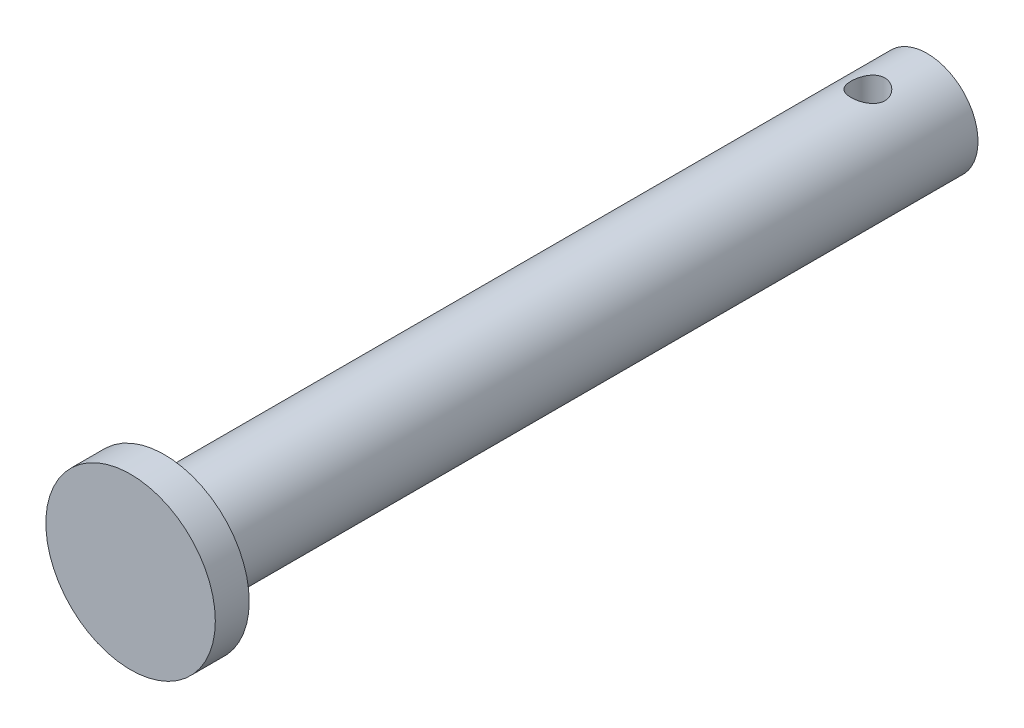
ISO-10303-21;
HEADER;
FILE_DESCRIPTION(('STEP AP214'),'2;1');
FILE_NAME('part.step','',(''),(''),'','','');
FILE_SCHEMA(('AUTOMOTIVE_DESIGN { 1 0 10303 214 1 1 1 1 }'));
ENDSEC;
DATA;
#1=APPLICATION_CONTEXT('core data for automotive mechanical design processes');
#2=APPLICATION_PROTOCOL_DEFINITION('international standard','automotive_design',2000,#1);
#3=PRODUCT_CONTEXT('',#1,'mechanical');
#4=PRODUCT('Part','Part','',(#3));
#5=PRODUCT_RELATED_PRODUCT_CATEGORY('part','',(#4));
#6=PRODUCT_DEFINITION_FORMATION('','',#4);
#7=PRODUCT_DEFINITION_CONTEXT('part definition',#1,'design');
#8=PRODUCT_DEFINITION('design','',#6,#7);
#9=PRODUCT_DEFINITION_SHAPE('','',#8);
#10=(LENGTH_UNIT() NAMED_UNIT(*) SI_UNIT(.MILLI.,.METRE.));
#11=(NAMED_UNIT(*) PLANE_ANGLE_UNIT() SI_UNIT($,.RADIAN.));
#12=(NAMED_UNIT(*) SI_UNIT($,.STERADIAN.) SOLID_ANGLE_UNIT());
#13=UNCERTAINTY_MEASURE_WITH_UNIT(LENGTH_MEASURE(1.E-05),#10,'distance_accuracy_value','');
#14=(GEOMETRIC_REPRESENTATION_CONTEXT(3) GLOBAL_UNCERTAINTY_ASSIGNED_CONTEXT((#13)) GLOBAL_UNIT_ASSIGNED_CONTEXT((#10,
#11,#12)) REPRESENTATION_CONTEXT('',''));
#15=CARTESIAN_POINT('',(0.,0.,0.));
#16=DIRECTION('',(0.,0.,1.));
#17=DIRECTION('',(1.,0.,0.));
#18=AXIS2_PLACEMENT_3D('',#15,#16,#17);
#19=CARTESIAN_POINT('',(0.,-5.,3.5));
#20=DIRECTION('',(0.,1.,0.));
#21=DIRECTION('',(0.,0.,1.));
#22=AXIS2_PLACEMENT_3D('',#19,#20,#21);
#23=CYLINDRICAL_SURFACE('',#22,1.);
#24=CARTESIAN_POINT('',(0.,-1.5,4.5));
#25=CARTESIAN_POINT('',(0.0502423583340643,-1.50000020822414,4.50000027481625));
#26=CARTESIAN_POINT('',(0.100484543566458,-1.49745401376693,4.49619301502226));
#27=CARTESIAN_POINT('',(0.199366529015833,-1.48752326211906,4.48120156794717));
#28=CARTESIAN_POINT('',(0.248005556977501,-1.48013640790618,4.47001387843836));
#29=CARTESIAN_POINT('',(0.342106153927126,-1.46125241202354,4.44094614133759));
#30=CARTESIAN_POINT('',(0.387581436328777,-1.44977452746657,4.42309742999603));
#31=CARTESIAN_POINT('',(0.474707645498629,-1.4236306893872,4.38146831836425));
#32=CARTESIAN_POINT('',(0.516358015804833,-1.40896427302755,4.35768705684972));
#33=CARTESIAN_POINT('',(0.598642350385054,-1.37613664684919,4.30267153131629));
#34=CARTESIAN_POINT('',(0.638890152730337,-1.3577844878966,4.27097606962856));
#35=CARTESIAN_POINT('',(0.713864022346369,-1.31991156541733,4.20213497567078));
#36=CARTESIAN_POINT('',(0.748582027719438,-1.30038915178416,4.16498153508114));
#37=CARTESIAN_POINT('',(0.81711148872748,-1.25864132339397,4.07947381619367));
#38=CARTESIAN_POINT('',(0.849915931813755,-1.23647533968899,4.03027717339828));
#39=CARTESIAN_POINT('',(0.906751785070868,-1.19542073676408,3.92581831117673));
#40=CARTESIAN_POINT('',(0.930798367132494,-1.17652647977327,3.87056679921861));
#41=CARTESIAN_POINT('',(0.963370175057203,-1.14988133320735,3.77164435328921));
#42=CARTESIAN_POINT('',(0.974372236180082,-1.14048813946218,3.72923577356309));
#43=CARTESIAN_POINT('',(0.9907530889261,-1.12628984829786,3.64262774762914));
#44=CARTESIAN_POINT('',(0.996141573259661,-1.12147684372013,3.59843152563681));
#45=CARTESIAN_POINT('',(1.00095682070629,-1.11718302804083,3.50926261057193));
#46=CARTESIAN_POINT('',(1.0003592145882,-1.11772401279478,3.46428748827441));
#47=CARTESIAN_POINT('',(0.993187906666196,-1.12409887741485,3.37518251324952));
#48=CARTESIAN_POINT('',(0.986609141899785,-1.12993724142592,3.33105340898369));
#49=CARTESIAN_POINT('',(0.968324971088713,-1.14563592995791,3.24676647438121));
#50=CARTESIAN_POINT('',(0.956858557405004,-1.15530744165153,3.20651933203848));
#51=CARTESIAN_POINT('',(0.929350592909502,-1.17754811463845,3.12848815450425));
#52=CARTESIAN_POINT('',(0.913307536614355,-1.19011822916388,3.09070493485137));
#53=CARTESIAN_POINT('',(0.87336909369832,-1.21982098202212,3.01048730235886));
#54=CARTESIAN_POINT('',(0.848540261643844,-1.23736158924507,2.96867004990595));
#55=CARTESIAN_POINT('',(0.793344802336531,-1.27345768922483,2.8893083025081));
#56=CARTESIAN_POINT('',(0.76297134504034,-1.29201441370946,2.85176917116288));
#57=CARTESIAN_POINT('',(0.689905826559714,-1.33271671862095,2.77372872714444));
#58=CARTESIAN_POINT('',(0.645969691404503,-1.35477372355024,2.7343329756443));
#59=CARTESIAN_POINT('',(0.551003999553815,-1.39609050337856,2.66340175274507));
#60=CARTESIAN_POINT('',(0.499981149675169,-1.41535288825285,2.63185892729896));
#61=CARTESIAN_POINT('',(0.402428913545607,-1.44572702044166,2.5832611406858));
#62=CARTESIAN_POINT('',(0.356978821685248,-1.45769630582498,2.56457831832979));
#63=CARTESIAN_POINT('',(0.263018021968461,-1.47753859515521,2.53394753718806));
#64=CARTESIAN_POINT('',(0.214509939501024,-1.48541506063844,2.52199388643409));
#65=CARTESIAN_POINT('',(0.115492726585953,-1.49637941078331,2.50541941738081));
#66=CARTESIAN_POINT('',(0.064975905967029,-1.49944661230576,2.50083026953082));
#67=CARTESIAN_POINT('',(-0.0362207596946121,-1.50041557482591,2.49937645571895));
#68=CARTESIAN_POINT('',(-0.0869005930932775,-1.49831769692815,2.50251124975561));
#69=CARTESIAN_POINT('',(-0.183227858602143,-1.48949794712138,2.51581202778098));
#70=CARTESIAN_POINT('',(-0.228978722339652,-1.48311123195135,2.52546864887766));
#71=CARTESIAN_POINT('',(-0.318058196213637,-1.46659224642397,2.55079784300638));
#72=CARTESIAN_POINT('',(-0.361386418785352,-1.45645937873408,2.5664713754639));
#73=CARTESIAN_POINT('',(-0.447332375233219,-1.4324817626467,2.60432614852268));
#74=CARTESIAN_POINT('',(-0.489748092316562,-1.41844935068245,2.62684407704176));
#75=CARTESIAN_POINT('',(-0.570341511977788,-1.38800927805403,2.67721664497231));
#76=CARTESIAN_POINT('',(-0.608516574097253,-1.37160015200652,2.70507458026297));
#77=CARTESIAN_POINT('',(-0.685927227415322,-1.33477273328243,2.77030393408237));
#78=CARTESIAN_POINT('',(-0.724375937862664,-1.31413078406203,2.80848313005202));
#79=CARTESIAN_POINT('',(-0.794669840332391,-1.27285586536855,2.89055571496407));
#80=CARTESIAN_POINT('',(-0.826510468230432,-1.25222291185946,2.9344530194994));
#81=CARTESIAN_POINT('',(-0.880623882794763,-1.21469839506517,3.0235712064292));
#82=CARTESIAN_POINT('',(-0.903478180804393,-1.19763798588662,3.06836601689986));
#83=CARTESIAN_POINT('',(-0.94248106887625,-1.16719487207113,3.16193632639057));
#84=CARTESIAN_POINT('',(-0.958641728453857,-1.1538055628277,3.2107044691977));
#85=CARTESIAN_POINT('',(-0.981179217293118,-1.13466604076532,3.30228224356704));
#86=CARTESIAN_POINT('',(-0.988792987823091,-1.12797499006895,3.34458590492947));
#87=CARTESIAN_POINT('',(-0.998496029624887,-1.11939733222928,3.43028664066772));
#88=CARTESIAN_POINT('',(-1.00059130142516,-1.11750550674066,3.47368247557323));
#89=CARTESIAN_POINT('',(-0.999119609907757,-1.11882100574833,3.56032152835836));
#90=CARTESIAN_POINT('',(-0.995549293852657,-1.12203134956834,3.60356464068146));
#91=CARTESIAN_POINT('',(-0.982984986109972,-1.1330522619864,3.68867176427148));
#92=CARTESIAN_POINT('',(-0.973983758587651,-1.14086896751217,3.73053385693038));
#93=CARTESIAN_POINT('',(-0.94796517835631,-1.1626342196827,3.82285559321431));
#94=CARTESIAN_POINT('',(-0.929450935941995,-1.17766166854602,3.87263385636953));
#95=CARTESIAN_POINT('',(-0.885422631474875,-1.21111080629161,3.96774341708941));
#96=CARTESIAN_POINT('',(-0.859898741785422,-1.22953724861882,4.01306834896843));
#97=CARTESIAN_POINT('',(-0.801991402694658,-1.26808593269725,4.09964094359684));
#98=CARTESIAN_POINT('',(-0.769491549448272,-1.2882329369107,4.14079937271926));
#99=CARTESIAN_POINT('',(-0.698358840177309,-1.32814150773993,4.21766123912123));
#100=CARTESIAN_POINT('',(-0.659724105134951,-1.3479029541764,4.25336299851241));
#101=CARTESIAN_POINT('',(-0.570728664877768,-1.38815775980392,4.32335605215706));
#102=CARTESIAN_POINT('',(-0.519480834775986,-1.40834902724558,4.35670932008983));
#103=CARTESIAN_POINT('',(-0.410434277887489,-1.44388832937518,4.41395663833199));
#104=CARTESIAN_POINT('',(-0.352646031225021,-1.45924396722731,4.43786555341182));
#105=CARTESIAN_POINT('',(-0.245717534917524,-1.48050822418367,4.47057728908202));
#106=CARTESIAN_POINT('',(-0.197506162628866,-1.48775740184446,4.48155551954935));
#107=CARTESIAN_POINT('',(-0.0995290060120642,-1.49750140070948,4.49626401626902));
#108=CARTESIAN_POINT('',(-0.0497644180940279,-1.49999979375663,4.499999727798));
#109=CARTESIAN_POINT('',(0.,-1.5,4.5));
#110=B_SPLINE_CURVE_WITH_KNOTS('',3,(#24,#25,#26,#27,#28,#29,#30,#31,#32,#33,#34,#35,#36,#37,
#38,#39,#40,#41,#42,#43,#44,#45,#46,#47,#48,#49,#50,#51,#52,#53,#54,#55,#56,#57,#58,#59,#60,#61,
#62,#63,#64,#65,#66,#67,#68,#69,#70,#71,#72,#73,#74,#75,#76,#77,#78,#79,#80,#81,#82,#83,#84,#85,
#86,#87,#88,#89,#90,#91,#92,#93,#94,#95,#96,#97,#98,#99,#100,#101,#102,#103,#104,#105,#106,#107,
#108,#109),.UNSPECIFIED.,.T.,.F.,(4,2,2,2,2,2,2,2,2,2,2,2,2,2,2,2,2,2,2,2,2,2,2,2,2,2,2,2,2,2,2,
2,2,2,2,2,2,2,2,2,2,2,4),(0.,0.150526613252699,0.301124707174343,0.451023076595115,
0.600943219336931,0.763585145002782,0.926462058021591,1.11503341647991,1.30327652722719,
1.43716846838014,1.57082883922904,1.70503355867689,1.83935198631676,1.96774431099011,
2.09617891902539,2.25073787329797,2.40548851889212,2.5935947724756,2.78152420149864,
2.93262043847562,3.0835886757059,3.23520441646309,3.38680955765891,3.5277654239542,
3.66874377568319,3.81826173413942,3.96787227471786,4.1411408806983,4.31452876587063,
4.473249676497,4.63168313315305,4.76162024003011,4.89141600161489,5.02128860137217,
5.15133461921144,5.31603304346011,5.48096356682587,5.64889622595852,5.81688041978686,
6.00897675773025,6.20076953274023,6.34997645676983,6.49907115623394),.UNSPECIFIED.);
#111=CARTESIAN_POINT('',(0.,-1.5,4.5));
#112=VERTEX_POINT('',#111);
#113=EDGE_CURVE('E42',#112,#112,#110,.T.);
#114=ORIENTED_EDGE('',*,*,#113,.T.);
#115=EDGE_LOOP('',(#114));
#116=FACE_BOUND('',#115,.T.);
#117=CARTESIAN_POINT('',(0.,-3.,4.5));
#118=CARTESIAN_POINT('',(0.0545633628867237,-3.00000015300943,4.50000025373164));
#119=CARTESIAN_POINT('',(0.10912519453855,-2.99849769507545,4.49551973387279));
#120=CARTESIAN_POINT('',(0.216641760872972,-2.99265210203281,4.47777089118278));
#121=CARTESIAN_POINT('',(0.269596328118818,-2.98830867202153,4.46450165605108));
#122=CARTESIAN_POINT('',(0.372332789501776,-2.97725307906443,4.42968075661596));
#123=CARTESIAN_POINT('',(0.422119825886034,-2.97054487730853,4.40814293754073));
#124=CARTESIAN_POINT('',(0.517374936805325,-2.95544445717342,4.35745882716166));
#125=CARTESIAN_POINT('',(0.562842156958706,-2.94705190667778,4.3283110349974));
#126=CARTESIAN_POINT('',(0.649741675022266,-2.92914094443005,4.26217419514125));
#127=CARTESIAN_POINT('',(0.691003700298309,-2.91959556463785,4.22496876573951));
#128=CARTESIAN_POINT('',(0.766832692702084,-2.90060314783122,4.14423284529344));
#129=CARTESIAN_POINT('',(0.801398185489462,-2.89115613290549,4.10070096507149));
#130=CARTESIAN_POINT('',(0.863824942227859,-2.87313332477274,4.00701488480354));
#131=CARTESIAN_POINT('',(0.891464858221032,-2.86459039275688,3.95670626026788));
#132=CARTESIAN_POINT('',(0.937818873877722,-2.84975305418601,3.85182390554146));
#133=CARTESIAN_POINT('',(0.956535697386765,-2.84345796160746,3.79725148283726));
#134=CARTESIAN_POINT('',(0.983873461509164,-2.83411303269377,3.68732677850329));
#135=CARTESIAN_POINT('',(0.99281344827177,-2.83096095769611,3.63206279151094));
#136=CARTESIAN_POINT('',(1.00134112333448,-2.82795656629508,3.52073624584412));
#137=CARTESIAN_POINT('',(1.00093170160472,-2.8281032302273,3.46467393929081));
#138=CARTESIAN_POINT('',(0.99101990370342,-2.8315901500818,3.35606336955598));
#139=CARTESIAN_POINT('',(0.981933913166995,-2.83478415867533,3.30347159708098));
#140=CARTESIAN_POINT('',(0.955606162849418,-2.84376657724551,3.20060658039317));
#141=CARTESIAN_POINT('',(0.938363426591871,-2.84955529784108,3.15033361456493));
#142=CARTESIAN_POINT('',(0.895939058060211,-2.86317911131249,3.05258725040852));
#143=CARTESIAN_POINT('',(0.870634048707263,-2.87104565793117,3.00517197453048));
#144=CARTESIAN_POINT('',(0.81288910630314,-2.88792558575726,2.91512909172028));
#145=CARTESIAN_POINT('',(0.780447112364006,-2.89693929790464,2.87250287306662));
#146=CARTESIAN_POINT('',(0.707349332682238,-2.91567329167741,2.79090840183923));
#147=CARTESIAN_POINT('',(0.666353150076312,-2.92540589354843,2.75224730549093));
#148=CARTESIAN_POINT('',(0.578339569970065,-2.94406938387037,2.68226873333661));
#149=CARTESIAN_POINT('',(0.531321595660815,-2.95300019538067,2.65095196183551));
#150=CARTESIAN_POINT('',(0.431947613046269,-2.96917107937794,2.59630369976493));
#151=CARTESIAN_POINT('',(0.379543276416337,-2.97639350008039,2.57305450865927));
#152=CARTESIAN_POINT('',(0.271269083364509,-2.98820567144435,2.53579682604429));
#153=CARTESIAN_POINT('',(0.215400438154955,-2.99279633654879,2.52178512457656));
#154=CARTESIAN_POINT('',(0.104383829529305,-2.99867627071441,2.50394433397764));
#155=CARTESIAN_POINT('',(0.0493095998648463,-3.00010001833731,2.49970019082725));
#156=CARTESIAN_POINT('',(-0.0607750699602355,-2.99988902694825,2.50033267359847));
#157=CARTESIAN_POINT('',(-0.115785519319646,-2.99825480419352,2.50520775997987));
#158=CARTESIAN_POINT('',(-0.222519866304258,-2.99220024717114,2.52361190773597));
#159=CARTESIAN_POINT('',(-0.274292806834856,-2.98786198711228,2.53688620604953));
#160=CARTESIAN_POINT('',(-0.37485595857956,-2.97691846830034,2.5713934444667));
#161=CARTESIAN_POINT('',(-0.423645788508559,-2.97031292046541,2.59262739946768));
#162=CARTESIAN_POINT('',(-0.518288296393321,-2.95528931287427,2.6430704318409));
#163=CARTESIAN_POINT('',(-0.564029959217329,-2.94682814756305,2.6724745932836));
#164=CARTESIAN_POINT('',(-0.650064830135404,-2.92905253915743,2.73819415001306));
#165=CARTESIAN_POINT('',(-0.690356367794894,-2.91973783591888,2.77451165603016));
#166=CARTESIAN_POINT('',(-0.766252507807013,-2.90076847982472,2.85497875100827));
#167=CARTESIAN_POINT('',(-0.801560969248491,-2.89111761095155,2.89940922693325));
#168=CARTESIAN_POINT('',(-0.864257522320853,-2.87299973286981,2.9937715678045));
#169=CARTESIAN_POINT('',(-0.891645547920843,-2.8645327335312,3.04370347861021));
#170=CARTESIAN_POINT('',(-0.93759693042336,-2.84982391820308,3.1476730153066));
#171=CARTESIAN_POINT('',(-0.956178132197766,-2.84357760900632,3.20170207924278));
#172=CARTESIAN_POINT('',(-0.983894666792162,-2.83410832399133,3.31237865012415));
#173=CARTESIAN_POINT('',(-0.993034254961243,-2.83088398622698,3.36902496543307));
#174=CARTESIAN_POINT('',(-1.00127628247038,-2.82797858875071,3.48019709601321));
#175=CARTESIAN_POINT('',(-1.00087025731093,-2.82812400344299,3.53468234025174));
#176=CARTESIAN_POINT('',(-0.991242293454878,-2.8315126992356,3.64276507489974));
#177=CARTESIAN_POINT('',(-0.982020879458887,-2.83475579595884,3.69636261795291));
#178=CARTESIAN_POINT('',(-0.95537181312698,-2.84384524278943,3.80013566301267));
#179=CARTESIAN_POINT('',(-0.93810334601488,-2.84964098015514,3.85035682500723));
#180=CARTESIAN_POINT('',(-0.895979365760382,-2.86316398825434,3.94722740693553));
#181=CARTESIAN_POINT('',(-0.871122168553979,-2.87089168765297,3.99387603118726));
#182=CARTESIAN_POINT('',(-0.813260692583249,-2.8878282922406,4.08448366992369));
#183=CARTESIAN_POINT('',(-0.779948242764532,-2.89708711641604,4.1282365018986));
#184=CARTESIAN_POINT('',(-0.706642883135697,-2.91583356283786,4.20968981338399));
#185=CARTESIAN_POINT('',(-0.666648084451495,-2.92532124912518,4.24738857568802));
#186=CARTESIAN_POINT('',(-0.579241556920674,-2.94390030525393,4.31714441228924));
#187=CARTESIAN_POINT('',(-0.531601513499725,-2.95296181801216,4.34892434775102));
#188=CARTESIAN_POINT('',(-0.431357357406628,-2.96925991172652,4.40399042885063));
#189=CARTESIAN_POINT('',(-0.378754518132349,-2.9764969590794,4.42727874592204));
#190=CARTESIAN_POINT('',(-0.272493647200975,-2.98805515068532,4.46372163248868));
#191=CARTESIAN_POINT('',(-0.218987757676408,-2.9924921242252,4.47728246626338));
#192=CARTESIAN_POINT('',(-0.110320416010247,-2.99846407064225,4.49542028067713));
#193=CARTESIAN_POINT('',(-0.0551594255687462,-2.99999984531906,4.49999974349654));
#194=CARTESIAN_POINT('',(0.,-3.,4.5));
#195=B_SPLINE_CURVE_WITH_KNOTS('',3,(#117,#118,#119,#120,#121,#122,#123,#124,#125,#126,#127,
#128,#129,#130,#131,#132,#133,#134,#135,#136,#137,#138,#139,#140,#141,#142,#143,#144,#145,#146,
#147,#148,#149,#150,#151,#152,#153,#154,#155,#156,#157,#158,#159,#160,#161,#162,#163,#164,#165,
#166,#167,#168,#169,#170,#171,#172,#173,#174,#175,#176,#177,#178,#179,#180,#181,#182,#183,#184,
#185,#186,#187,#188,#189,#190,#191,#192,#193,#194),.UNSPECIFIED.,.T.,.F.,(4,2,2,2,2,2,2,2,2,2,2,
2,2,2,2,2,2,2,2,2,2,2,2,2,2,2,2,2,2,2,2,2,2,2,2,2,2,2,4),(0.,0.163487106026011,0.32699118526752,
0.490222672870273,0.653486377799099,0.821846842827558,0.990244332875302,1.1634838482347,
1.33667044692833,1.5040192574184,1.67131633987486,1.8309682655128,1.99063930855482,
2.15288171155131,2.31517102558207,2.48593305811367,2.65671145966618,2.82918405650358,
3.00159668877208,3.1665358317517,3.33144713164177,3.49158157978214,3.65173645284104,
3.81610399843737,3.98052180821891,4.15241022880752,4.32430008234997,4.49584013824416,
4.66730284700846,4.82995666056619,4.99260079341185,5.15215587070228,5.31174638165788,
5.47830066681615,5.64490211113589,5.81799660824911,5.99104681142266,6.15636558363624,
6.3216386602795),.UNSPECIFIED.);
#196=CARTESIAN_POINT('',(0.,-3.,4.5));
#197=VERTEX_POINT('',#196);
#198=EDGE_CURVE('E68',#197,#197,#195,.T.);
#199=ORIENTED_EDGE('',*,*,#198,.F.);
#200=EDGE_LOOP('',(#199));
#201=FACE_BOUND('',#200,.T.);
#202=ADVANCED_FACE('F37',(#116,#201),#23,.F.);
#203=CARTESIAN_POINT('',(0.,0.,45.));
#204=DIRECTION('',(0.,0.,-1.));
#205=DIRECTION('',(-1.,0.,0.));
#206=AXIS2_PLACEMENT_3D('',#203,#204,#205);
#207=CYLINDRICAL_SURFACE('',#206,3.);
#208=ORIENTED_EDGE('',*,*,#198,.T.);
#209=EDGE_LOOP('',(#208));
#210=FACE_BOUND('',#209,.T.);
#211=CARTESIAN_POINT('',(0.,3.,4.5));
#212=CARTESIAN_POINT('',(-0.0545633628867228,3.00000015300944,4.50000025373164));
#213=CARTESIAN_POINT('',(-0.109125194538549,2.99849769507545,4.49551973387279));
#214=CARTESIAN_POINT('',(-0.216641760872972,2.99265210203281,4.47777089118278));
#215=CARTESIAN_POINT('',(-0.269596328118817,2.98830867202153,4.46450165605108));
#216=CARTESIAN_POINT('',(-0.372332789501775,2.97725307906443,4.42968075661596));
#217=CARTESIAN_POINT('',(-0.422119825886033,2.97054487730853,4.40814293754073));
#218=CARTESIAN_POINT('',(-0.517374936805324,2.95544445717342,4.35745882716166));
#219=CARTESIAN_POINT('',(-0.562842156958705,2.94705190667778,4.3283110349974));
#220=CARTESIAN_POINT('',(-0.649741675022265,2.92914094443005,4.26217419514125));
#221=CARTESIAN_POINT('',(-0.691003700298308,2.91959556463785,4.22496876573951));
#222=CARTESIAN_POINT('',(-0.766832692702083,2.90060314783122,4.14423284529344));
#223=CARTESIAN_POINT('',(-0.801398185489461,2.89115613290549,4.10070096507149));
#224=CARTESIAN_POINT('',(-0.863824942227858,2.87313332477274,4.00701488480354));
#225=CARTESIAN_POINT('',(-0.891464858221031,2.86459039275688,3.95670626026788));
#226=CARTESIAN_POINT('',(-0.937818873877721,2.84975305418601,3.85182390554146));
#227=CARTESIAN_POINT('',(-0.956535697386764,2.84345796160746,3.79725148283726));
#228=CARTESIAN_POINT('',(-0.983873461509163,2.83411303269377,3.68732677850329));
#229=CARTESIAN_POINT('',(-0.992813448271769,2.83096095769611,3.63206279151094));
#230=CARTESIAN_POINT('',(-1.00134112333448,2.82795656629508,3.52073624584412));
#231=CARTESIAN_POINT('',(-1.00093170160472,2.8281032302273,3.46467393929081));
#232=CARTESIAN_POINT('',(-0.991019903703419,2.8315901500818,3.35606336955598));
#233=CARTESIAN_POINT('',(-0.981933913166994,2.83478415867533,3.30347159708098));
#234=CARTESIAN_POINT('',(-0.955606162849417,2.84376657724551,3.20060658039317));
#235=CARTESIAN_POINT('',(-0.938363426591871,2.84955529784108,3.15033361456493));
#236=CARTESIAN_POINT('',(-0.895939058060211,2.86317911131249,3.05258725040852));
#237=CARTESIAN_POINT('',(-0.870634048707262,2.87104565793117,3.00517197453048));
#238=CARTESIAN_POINT('',(-0.812889106303139,2.88792558575726,2.91512909172028));
#239=CARTESIAN_POINT('',(-0.780447112364005,2.89693929790464,2.87250287306662));
#240=CARTESIAN_POINT('',(-0.707349332682237,2.91567329167741,2.79090840183923));
#241=CARTESIAN_POINT('',(-0.666353150076311,2.92540589354843,2.75224730549093));
#242=CARTESIAN_POINT('',(-0.578339569970064,2.94406938387037,2.68226873333661));
#243=CARTESIAN_POINT('',(-0.531321595660815,2.95300019538067,2.65095196183551));
#244=CARTESIAN_POINT('',(-0.431947613046268,2.96917107937794,2.59630369976493));
#245=CARTESIAN_POINT('',(-0.379543276416337,2.97639350008039,2.57305450865927));
#246=CARTESIAN_POINT('',(-0.271269083364508,2.98820567144435,2.53579682604429));
#247=CARTESIAN_POINT('',(-0.215400438154955,2.99279633654879,2.52178512457656));
#248=CARTESIAN_POINT('',(-0.104383829529304,2.99867627071441,2.50394433397764));
#249=CARTESIAN_POINT('',(-0.0493095998648456,3.00010001833731,2.49970019082725));
#250=CARTESIAN_POINT('',(0.0607750699602361,2.99988902694825,2.50033267359847));
#251=CARTESIAN_POINT('',(0.115785519319647,2.99825480419352,2.50520775997987));
#252=CARTESIAN_POINT('',(0.222519866304259,2.99220024717114,2.52361190773597));
#253=CARTESIAN_POINT('',(0.274292806834856,2.98786198711228,2.53688620604953));
#254=CARTESIAN_POINT('',(0.374855958579561,2.97691846830034,2.5713934444667));
#255=CARTESIAN_POINT('',(0.423645788508559,2.97031292046541,2.59262739946768));
#256=CARTESIAN_POINT('',(0.518288296393322,2.95528931287427,2.6430704318409));
#257=CARTESIAN_POINT('',(0.56402995921733,2.94682814756305,2.6724745932836));
#258=CARTESIAN_POINT('',(0.650064830135404,2.92905253915743,2.73819415001306));
#259=CARTESIAN_POINT('',(0.690356367794894,2.91973783591888,2.77451165603016));
#260=CARTESIAN_POINT('',(0.766252507807014,2.90076847982472,2.85497875100827));
#261=CARTESIAN_POINT('',(0.801560969248492,2.89111761095155,2.89940922693325));
#262=CARTESIAN_POINT('',(0.864257522320854,2.87299973286981,2.9937715678045));
#263=CARTESIAN_POINT('',(0.891645547920844,2.8645327335312,3.04370347861021));
#264=CARTESIAN_POINT('',(0.937596930423361,2.84982391820308,3.1476730153066));
#265=CARTESIAN_POINT('',(0.956178132197766,2.84357760900632,3.20170207924278));
#266=CARTESIAN_POINT('',(0.983894666792163,2.83410832399133,3.31237865012415));
#267=CARTESIAN_POINT('',(0.993034254961244,2.83088398622698,3.36902496543307));
#268=CARTESIAN_POINT('',(1.00127628247038,2.82797858875071,3.48019709601321));
#269=CARTESIAN_POINT('',(1.00087025731093,2.82812400344299,3.53468234025174));
#270=CARTESIAN_POINT('',(0.991242293454879,2.8315126992356,3.64276507489974));
#271=CARTESIAN_POINT('',(0.982020879458888,2.83475579595884,3.69636261795291));
#272=CARTESIAN_POINT('',(0.955371813126981,2.84384524278943,3.80013566301267));
#273=CARTESIAN_POINT('',(0.93810334601488,2.84964098015514,3.85035682500723));
#274=CARTESIAN_POINT('',(0.895979365760383,2.86316398825434,3.94722740693553));
#275=CARTESIAN_POINT('',(0.87112216855398,2.87089168765297,3.99387603118726));
#276=CARTESIAN_POINT('',(0.81326069258325,2.8878282922406,4.08448366992369));
#277=CARTESIAN_POINT('',(0.779948242764533,2.89708711641604,4.1282365018986));
#278=CARTESIAN_POINT('',(0.706642883135698,2.91583356283786,4.20968981338399));
#279=CARTESIAN_POINT('',(0.666648084451496,2.92532124912518,4.24738857568802));
#280=CARTESIAN_POINT('',(0.579241556920675,2.94390030525393,4.31714441228924));
#281=CARTESIAN_POINT('',(0.531601513499726,2.95296181801216,4.34892434775102));
#282=CARTESIAN_POINT('',(0.431357357406629,2.96925991172652,4.40399042885063));
#283=CARTESIAN_POINT('',(0.37875451813235,2.9764969590794,4.42727874592204));
#284=CARTESIAN_POINT('',(0.272493647200976,2.98805515068532,4.46372163248868));
#285=CARTESIAN_POINT('',(0.218987757676409,2.9924921242252,4.47728246626338));
#286=CARTESIAN_POINT('',(0.110320416010248,2.99846407064225,4.49542028067713));
#287=CARTESIAN_POINT('',(0.055159425568747,2.99999984531906,4.49999974349654));
#288=CARTESIAN_POINT('',(0.,3.,4.5));
#289=B_SPLINE_CURVE_WITH_KNOTS('',3,(#211,#212,#213,#214,#215,#216,#217,#218,#219,#220,#221,
#222,#223,#224,#225,#226,#227,#228,#229,#230,#231,#232,#233,#234,#235,#236,#237,#238,#239,#240,
#241,#242,#243,#244,#245,#246,#247,#248,#249,#250,#251,#252,#253,#254,#255,#256,#257,#258,#259,
#260,#261,#262,#263,#264,#265,#266,#267,#268,#269,#270,#271,#272,#273,#274,#275,#276,#277,#278,
#279,#280,#281,#282,#283,#284,#285,#286,#287,#288),.UNSPECIFIED.,.T.,.F.,(4,2,2,2,2,2,2,2,2,2,2,
2,2,2,2,2,2,2,2,2,2,2,2,2,2,2,2,2,2,2,2,2,2,2,2,2,2,2,4),(0.,0.163487106026011,0.32699118526752,
0.490222672870273,0.653486377799099,0.821846842827558,0.990244332875301,1.1634838482347,
1.33667044692833,1.5040192574184,1.67131633987485,1.8309682655128,1.99063930855482,
2.15288171155131,2.31517102558207,2.48593305811367,2.65671145966618,2.82918405650357,
3.00159668877208,3.1665358317517,3.33144713164177,3.49158157978213,3.65173645284104,
3.81610399843736,3.98052180821891,4.15241022880752,4.32430008234997,4.49584013824416,
4.66730284700846,4.82995666056619,4.99260079341185,5.15215587070227,5.31174638165787,
5.47830066681615,5.64490211113589,5.8179966082491,5.99104681142266,6.15636558363624,
6.3216386602795),.UNSPECIFIED.);
#290=CARTESIAN_POINT('',(0.,3.,4.5));
#291=VERTEX_POINT('',#290);
#292=EDGE_CURVE('E62',#291,#291,#289,.T.);
#293=ORIENTED_EDGE('',*,*,#292,.T.);
#294=EDGE_LOOP('',(#293));
#295=FACE_BOUND('',#294,.T.);
#296=CARTESIAN_POINT('',(0.,0.,45.));
#297=DIRECTION('',(0.,0.,1.));
#298=DIRECTION('',(1.,0.,0.));
#299=AXIS2_PLACEMENT_3D('',#296,#297,#298);
#300=CIRCLE('',#299,3.);
#301=CARTESIAN_POINT('',(3.,0.,45.));
#302=VERTEX_POINT('',#301);
#303=EDGE_CURVE('E10',#302,#302,#300,.T.);
#304=ORIENTED_EDGE('',*,*,#303,.F.);
#305=EDGE_LOOP('',(#304));
#306=FACE_BOUND('',#305,.T.);
#307=CARTESIAN_POINT('',(0.,0.,0.));
#308=DIRECTION('',(0.,0.,1.));
#309=DIRECTION('',(1.,0.,0.));
#310=AXIS2_PLACEMENT_3D('',#307,#308,#309);
#311=CIRCLE('',#310,3.);
#312=CARTESIAN_POINT('',(3.,0.,0.));
#313=VERTEX_POINT('',#312);
#314=EDGE_CURVE('E51',#313,#313,#311,.T.);
#315=ORIENTED_EDGE('',*,*,#314,.T.);
#316=EDGE_LOOP('',(#315));
#317=FACE_BOUND('',#316,.T.);
#318=ADVANCED_FACE('F39',(#210,#295,#306,#317),#207,.T.);
#319=CARTESIAN_POINT('',(0.,0.,0.));
#320=DIRECTION('',(0.,0.,1.));
#321=DIRECTION('',(1.,0.,0.));
#322=AXIS2_PLACEMENT_3D('',#319,#320,#321);
#323=PLANE('',#322);
#324=CARTESIAN_POINT('',(0.,0.,0.));
#325=DIRECTION('',(0.,0.,-1.));
#326=DIRECTION('',(-1.,0.,0.));
#327=AXIS2_PLACEMENT_3D('',#324,#325,#326);
#328=CIRCLE('',#327,1.5);
#329=CARTESIAN_POINT('',(-1.5,0.,0.));
#330=VERTEX_POINT('',#329);
#331=EDGE_CURVE('E123',#330,#330,#328,.T.);
#332=ORIENTED_EDGE('',*,*,#331,.F.);
#333=EDGE_LOOP('',(#332));
#334=FACE_BOUND('',#333,.T.);
#335=ORIENTED_EDGE('',*,*,#314,.F.);
#336=EDGE_LOOP('',(#335));
#337=FACE_BOUND('',#336,.T.);
#338=ADVANCED_FACE('F107',(#334,#337),#323,.F.);
#339=CARTESIAN_POINT('',(0.,0.,47.));
#340=DIRECTION('',(0.,0.,-1.));
#341=DIRECTION('',(-1.,0.,0.));
#342=AXIS2_PLACEMENT_3D('',#339,#340,#341);
#343=CYLINDRICAL_SURFACE('',#342,5.);
#344=CARTESIAN_POINT('',(0.,0.,47.));
#345=DIRECTION('',(0.,0.,1.));
#346=DIRECTION('',(1.,0.,0.));
#347=AXIS2_PLACEMENT_3D('',#344,#345,#346);
#348=CIRCLE('',#347,5.);
#349=CARTESIAN_POINT('',(5.,0.,47.));
#350=VERTEX_POINT('',#349);
#351=EDGE_CURVE('E56',#350,#350,#348,.T.);
#352=ORIENTED_EDGE('',*,*,#351,.F.);
#353=EDGE_LOOP('',(#352));
#354=FACE_BOUND('',#353,.T.);
#355=CARTESIAN_POINT('',(0.,0.,45.));
#356=DIRECTION('',(0.,0.,1.));
#357=DIRECTION('',(1.,0.,0.));
#358=AXIS2_PLACEMENT_3D('',#355,#356,#357);
#359=CIRCLE('',#358,5.);
#360=CARTESIAN_POINT('',(5.,0.,45.));
#361=VERTEX_POINT('',#360);
#362=EDGE_CURVE('E59',#361,#361,#359,.T.);
#363=ORIENTED_EDGE('',*,*,#362,.T.);
#364=EDGE_LOOP('',(#363));
#365=FACE_BOUND('',#364,.T.);
#366=ADVANCED_FACE('F130',(#354,#365),#343,.T.);
#367=CARTESIAN_POINT('',(0.,0.,47.));
#368=DIRECTION('',(0.,0.,1.));
#369=DIRECTION('',(1.,0.,0.));
#370=AXIS2_PLACEMENT_3D('',#367,#368,#369);
#371=PLANE('',#370);
#372=ORIENTED_EDGE('',*,*,#351,.T.);
#373=EDGE_LOOP('',(#372));
#374=FACE_BOUND('',#373,.T.);
#375=ADVANCED_FACE('F81',(#374),#371,.T.);
#376=CARTESIAN_POINT('',(0.,0.,45.));
#377=DIRECTION('',(0.,0.,1.));
#378=DIRECTION('',(1.,0.,0.));
#379=AXIS2_PLACEMENT_3D('',#376,#377,#378);
#380=PLANE('',#379);
#381=ORIENTED_EDGE('',*,*,#303,.T.);
#382=EDGE_LOOP('',(#381));
#383=FACE_BOUND('',#382,.T.);
#384=ORIENTED_EDGE('',*,*,#362,.F.);
#385=EDGE_LOOP('',(#384));
#386=FACE_BOUND('',#385,.T.);
#387=ADVANCED_FACE('F78',(#383,#386),#380,.F.);
#388=CARTESIAN_POINT('',(0.,1.5,4.5));
#389=CARTESIAN_POINT('',(-0.0502423583340634,1.50000020822414,4.50000027481625));
#390=CARTESIAN_POINT('',(-0.100484543566457,1.49745401376693,4.49619301502226));
#391=CARTESIAN_POINT('',(-0.199366529015832,1.48752326211906,4.48120156794717));
#392=CARTESIAN_POINT('',(-0.2480055569775,1.48013640790618,4.47001387843836));
#393=CARTESIAN_POINT('',(-0.342106153927125,1.46125241202354,4.44094614133759));
#394=CARTESIAN_POINT('',(-0.387581436328776,1.44977452746657,4.42309742999604));
#395=CARTESIAN_POINT('',(-0.474707645498627,1.4236306893872,4.38146831836425));
#396=CARTESIAN_POINT('',(-0.516358015804832,1.40896427302755,4.35768705684972));
#397=CARTESIAN_POINT('',(-0.598642350385052,1.37613664684919,4.30267153131629));
#398=CARTESIAN_POINT('',(-0.638890152730335,1.3577844878966,4.27097606962856));
#399=CARTESIAN_POINT('',(-0.713864022346367,1.31991156541733,4.20213497567078));
#400=CARTESIAN_POINT('',(-0.748582027719437,1.30038915178416,4.16498153508114));
#401=CARTESIAN_POINT('',(-0.817111488727479,1.25864132339397,4.07947381619367));
#402=CARTESIAN_POINT('',(-0.849915931813754,1.236475339689,4.03027717339828));
#403=CARTESIAN_POINT('',(-0.906751785070867,1.19542073676408,3.92581831117674));
#404=CARTESIAN_POINT('',(-0.930798367132493,1.17652647977327,3.87056679921862));
#405=CARTESIAN_POINT('',(-0.963370175057203,1.14988133320735,3.77164435328921));
#406=CARTESIAN_POINT('',(-0.974372236180081,1.14048813946218,3.72923577356309));
#407=CARTESIAN_POINT('',(-0.9907530889261,1.12628984829786,3.64262774762914));
#408=CARTESIAN_POINT('',(-0.99614157325966,1.12147684372013,3.59843152563681));
#409=CARTESIAN_POINT('',(-1.00095682070629,1.11718302804084,3.50926261057193));
#410=CARTESIAN_POINT('',(-1.0003592145882,1.11772401279478,3.46428748827441));
#411=CARTESIAN_POINT('',(-0.993187906666195,1.12409887741485,3.37518251324952));
#412=CARTESIAN_POINT('',(-0.986609141899784,1.12993724142592,3.33105340898369));
#413=CARTESIAN_POINT('',(-0.968324971088712,1.14563592995791,3.24676647438121));
#414=CARTESIAN_POINT('',(-0.956858557405003,1.15530744165153,3.20651933203848));
#415=CARTESIAN_POINT('',(-0.929350592909501,1.17754811463845,3.12848815450425));
#416=CARTESIAN_POINT('',(-0.913307536614355,1.19011822916388,3.09070493485137));
#417=CARTESIAN_POINT('',(-0.873369093698319,1.21982098202212,3.01048730235886));
#418=CARTESIAN_POINT('',(-0.848540261643843,1.23736158924507,2.96867004990595));
#419=CARTESIAN_POINT('',(-0.79334480233653,1.27345768922483,2.8893083025081));
#420=CARTESIAN_POINT('',(-0.762971345040339,1.29201441370946,2.85176917116288));
#421=CARTESIAN_POINT('',(-0.689905826559713,1.33271671862095,2.77372872714444));
#422=CARTESIAN_POINT('',(-0.645969691404502,1.35477372355024,2.7343329756443));
#423=CARTESIAN_POINT('',(-0.551003999553814,1.39609050337856,2.66340175274507));
#424=CARTESIAN_POINT('',(-0.499981149675168,1.41535288825285,2.63185892729896));
#425=CARTESIAN_POINT('',(-0.402428913545606,1.44572702044166,2.5832611406858));
#426=CARTESIAN_POINT('',(-0.356978821685246,1.45769630582498,2.56457831832979));
#427=CARTESIAN_POINT('',(-0.263018021968459,1.47753859515521,2.53394753718806));
#428=CARTESIAN_POINT('',(-0.214509939501023,1.48541506063844,2.52199388643409));
#429=CARTESIAN_POINT('',(-0.115492726585951,1.49637941078331,2.50541941738081));
#430=CARTESIAN_POINT('',(-0.0649759059670272,1.49944661230576,2.50083026953082));
#431=CARTESIAN_POINT('',(0.0362207596946139,1.50041557482591,2.49937645571895));
#432=CARTESIAN_POINT('',(0.0869005930932792,1.49831769692815,2.50251124975561));
#433=CARTESIAN_POINT('',(0.183227858602145,1.48949794712138,2.51581202778098));
#434=CARTESIAN_POINT('',(0.228978722339654,1.48311123195135,2.52546864887766));
#435=CARTESIAN_POINT('',(0.318058196213639,1.46659224642397,2.55079784300638));
#436=CARTESIAN_POINT('',(0.361386418785354,1.45645937873408,2.5664713754639));
#437=CARTESIAN_POINT('',(0.44733237523322,1.4324817626467,2.60432614852268));
#438=CARTESIAN_POINT('',(0.489748092316563,1.41844935068245,2.62684407704176));
#439=CARTESIAN_POINT('',(0.570341511977789,1.38800927805403,2.67721664497231));
#440=CARTESIAN_POINT('',(0.608516574097254,1.37160015200652,2.70507458026297));
#441=CARTESIAN_POINT('',(0.685927227415323,1.33477273328243,2.77030393408237));
#442=CARTESIAN_POINT('',(0.724375937862665,1.31413078406203,2.80848313005202));
#443=CARTESIAN_POINT('',(0.794669840332392,1.27285586536854,2.89055571496407));
#444=CARTESIAN_POINT('',(0.826510468230434,1.25222291185946,2.9344530194994));
#445=CARTESIAN_POINT('',(0.880623882794764,1.21469839506517,3.0235712064292));
#446=CARTESIAN_POINT('',(0.903478180804394,1.19763798588662,3.06836601689986));
#447=CARTESIAN_POINT('',(0.942481068876251,1.16719487207113,3.16193632639057));
#448=CARTESIAN_POINT('',(0.958641728453858,1.1538055628277,3.2107044691977));
#449=CARTESIAN_POINT('',(0.981179217293119,1.13466604076532,3.30228224356705));
#450=CARTESIAN_POINT('',(0.988792987823092,1.12797499006895,3.34458590492947));
#451=CARTESIAN_POINT('',(0.998496029624888,1.11939733222928,3.43028664066772));
#452=CARTESIAN_POINT('',(1.00059130142516,1.11750550674066,3.47368247557323));
#453=CARTESIAN_POINT('',(0.999119609907758,1.11882100574833,3.56032152835836));
#454=CARTESIAN_POINT('',(0.995549293852658,1.12203134956833,3.60356464068146));
#455=CARTESIAN_POINT('',(0.982984986109972,1.1330522619864,3.68867176427148));
#456=CARTESIAN_POINT('',(0.973983758587652,1.14086896751217,3.73053385693038));
#457=CARTESIAN_POINT('',(0.94796517835631,1.1626342196827,3.82285559321431));
#458=CARTESIAN_POINT('',(0.929450935941995,1.17766166854602,3.87263385636953));
#459=CARTESIAN_POINT('',(0.885422631474876,1.21111080629161,3.96774341708941));
#460=CARTESIAN_POINT('',(0.859898741785423,1.22953724861882,4.01306834896843));
#461=CARTESIAN_POINT('',(0.80199140269466,1.26808593269725,4.09964094359684));
#462=CARTESIAN_POINT('',(0.769491549448274,1.2882329369107,4.14079937271926));
#463=CARTESIAN_POINT('',(0.69835884017731,1.32814150773993,4.21766123912123));
#464=CARTESIAN_POINT('',(0.659724105134952,1.3479029541764,4.25336299851241));
#465=CARTESIAN_POINT('',(0.570728664877769,1.38815775980392,4.32335605215706));
#466=CARTESIAN_POINT('',(0.519480834775987,1.40834902724558,4.35670932008983));
#467=CARTESIAN_POINT('',(0.410434277887489,1.44388832937518,4.41395663833199));
#468=CARTESIAN_POINT('',(0.352646031225022,1.45924396722731,4.43786555341182));
#469=CARTESIAN_POINT('',(0.245717534917524,1.48050822418367,4.47057728908202));
#470=CARTESIAN_POINT('',(0.197506162628866,1.48775740184446,4.48155551954935));
#471=CARTESIAN_POINT('',(0.0995290060120649,1.49750140070948,4.49626401626902));
#472=CARTESIAN_POINT('',(0.0497644180940287,1.49999979375663,4.499999727798));
#473=CARTESIAN_POINT('',(0.,1.5,4.5));
#474=B_SPLINE_CURVE_WITH_KNOTS('',3,(#388,#389,#390,#391,#392,#393,#394,#395,#396,#397,#398,
#399,#400,#401,#402,#403,#404,#405,#406,#407,#408,#409,#410,#411,#412,#413,#414,#415,#416,#417,
#418,#419,#420,#421,#422,#423,#424,#425,#426,#427,#428,#429,#430,#431,#432,#433,#434,#435,#436,
#437,#438,#439,#440,#441,#442,#443,#444,#445,#446,#447,#448,#449,#450,#451,#452,#453,#454,#455,
#456,#457,#458,#459,#460,#461,#462,#463,#464,#465,#466,#467,#468,#469,#470,#471,#472,#473),
.UNSPECIFIED.,.T.,.F.,(4,2,2,2,2,2,2,2,2,2,2,2,2,2,2,2,2,2,2,2,2,2,2,2,2,2,2,2,2,2,2,2,2,2,2,2,
2,2,2,2,2,2,4),(0.,0.150526613252699,0.301124707174343,0.451023076595114,0.60094321933693,
0.763585145002781,0.92646205802159,1.11503341647991,1.30327652722719,1.43716846838014,
1.57082883922904,1.70503355867689,1.83935198631676,1.96774431099011,2.09617891902539,
2.25073787329797,2.40548851889212,2.5935947724756,2.78152420149864,2.93262043847562,
3.0835886757059,3.23520441646309,3.38680955765891,3.5277654239542,3.66874377568319,
3.81826173413942,3.96787227471786,4.1411408806983,4.31452876587063,4.473249676497,
4.63168313315305,4.76162024003011,4.8914160016149,5.02128860137217,5.15133461921144,
5.31603304346011,5.48096356682587,5.64889622595852,5.81688041978686,6.00897675773025,
6.20076953274023,6.34997645676983,6.49907115623394),.UNSPECIFIED.);
#475=CARTESIAN_POINT('',(0.,1.5,4.5));
#476=VERTEX_POINT('',#475);
#477=EDGE_CURVE('E86',#476,#476,#474,.T.);
#478=ORIENTED_EDGE('',*,*,#477,.T.);
#479=EDGE_LOOP('',(#478));
#480=FACE_BOUND('',#479,.T.);
#481=ORIENTED_EDGE('',*,*,#292,.F.);
#482=EDGE_LOOP('',(#481));
#483=FACE_BOUND('',#482,.T.);
#484=ADVANCED_FACE('F72',(#480,#483),#23,.F.);
#485=CARTESIAN_POINT('',(0.,0.,49.2426406871193));
#486=DIRECTION('',(0.,0.,-1.));
#487=DIRECTION('',(-1.,0.,0.));
#488=AXIS2_PLACEMENT_3D('',#485,#486,#487);
#489=CYLINDRICAL_SURFACE('',#488,1.5);
#490=ORIENTED_EDGE('',*,*,#477,.F.);
#491=EDGE_LOOP('',(#490));
#492=FACE_BOUND('',#491,.T.);
#493=ORIENTED_EDGE('',*,*,#331,.T.);
#494=EDGE_LOOP('',(#493));
#495=FACE_BOUND('',#494,.T.);
#496=CARTESIAN_POINT('',(0.,0.,45.));
#497=DIRECTION('',(0.,0.,1.));
#498=DIRECTION('',(1.,0.,0.));
#499=AXIS2_PLACEMENT_3D('',#496,#497,#498);
#500=CIRCLE('',#499,1.5);
#501=CARTESIAN_POINT('',(1.5,0.,45.));
#502=VERTEX_POINT('',#501);
#503=EDGE_CURVE('E91',#502,#502,#500,.F.);
#504=ORIENTED_EDGE('',*,*,#503,.F.);
#505=EDGE_LOOP('',(#504));
#506=FACE_BOUND('',#505,.T.);
#507=ORIENTED_EDGE('',*,*,#113,.F.);
#508=EDGE_LOOP('',(#507));
#509=FACE_BOUND('',#508,.T.);
#510=ADVANCED_FACE('F77',(#492,#495,#506,#509),#489,.F.);
#511=CARTESIAN_POINT('',(0.,0.,45.));
#512=DIRECTION('',(0.,0.,1.));
#513=DIRECTION('',(1.,0.,0.));
#514=AXIS2_PLACEMENT_3D('',#511,#512,#513);
#515=PLANE('',#514);
#516=ORIENTED_EDGE('',*,*,#503,.T.);
#517=EDGE_LOOP('',(#516));
#518=FACE_BOUND('',#517,.T.);
#519=ADVANCED_FACE('F80',(#518),#515,.F.);
#520=CLOSED_SHELL('',(#202,#318,#338,#366,#375,#387,#484,#510,#519));
#521=MANIFOLD_SOLID_BREP('B2',#520);
#522=ADVANCED_BREP_SHAPE_REPRESENTATION('',(#18,#521),#14);
#523=SHAPE_DEFINITION_REPRESENTATION(#9,#522);
ENDSEC;
END-ISO-10303-21;
